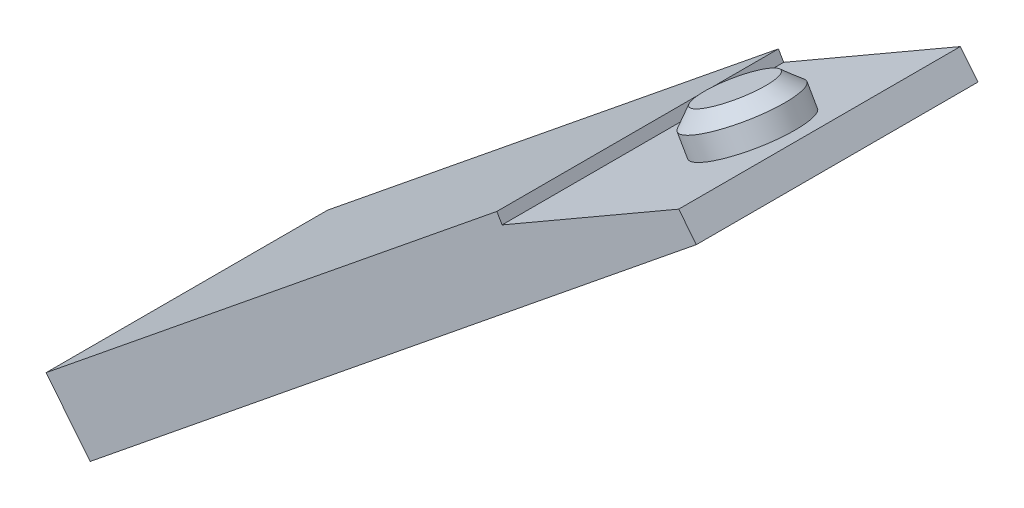
ISO-10303-21;
HEADER;
FILE_DESCRIPTION(('STEP AP214'),'2;1');
FILE_NAME('part.step','',(''),(''),'','','');
FILE_SCHEMA(('AUTOMOTIVE_DESIGN { 1 0 10303 214 1 1 1 1 }'));
ENDSEC;
DATA;
#1=APPLICATION_CONTEXT('core data for automotive mechanical design processes');
#2=APPLICATION_PROTOCOL_DEFINITION('international standard','automotive_design',2000,#1);
#3=PRODUCT_CONTEXT('',#1,'mechanical');
#4=PRODUCT('Part','Part','',(#3));
#5=PRODUCT_RELATED_PRODUCT_CATEGORY('part','',(#4));
#6=PRODUCT_DEFINITION_FORMATION('','',#4);
#7=PRODUCT_DEFINITION_CONTEXT('part definition',#1,'design');
#8=PRODUCT_DEFINITION('design','',#6,#7);
#9=PRODUCT_DEFINITION_SHAPE('','',#8);
#10=(LENGTH_UNIT() NAMED_UNIT(*) SI_UNIT(.MILLI.,.METRE.));
#11=(NAMED_UNIT(*) PLANE_ANGLE_UNIT() SI_UNIT($,.RADIAN.));
#12=(NAMED_UNIT(*) SI_UNIT($,.STERADIAN.) SOLID_ANGLE_UNIT());
#13=UNCERTAINTY_MEASURE_WITH_UNIT(LENGTH_MEASURE(1.E-05),#10,'distance_accuracy_value','');
#14=(GEOMETRIC_REPRESENTATION_CONTEXT(3) GLOBAL_UNCERTAINTY_ASSIGNED_CONTEXT((#13)) GLOBAL_UNIT_ASSIGNED_CONTEXT((#10,
#11,#12)) REPRESENTATION_CONTEXT('',''));
#15=CARTESIAN_POINT('',(0.,0.,0.));
#16=DIRECTION('',(0.,0.,1.));
#17=DIRECTION('',(1.,0.,0.));
#18=AXIS2_PLACEMENT_3D('',#15,#16,#17);
#19=CARTESIAN_POINT('',(-26.266761163299,4.46478752407708,10.));
#20=DIRECTION('',(0.5,-0.866025403784438,0.));
#21=DIRECTION('',(0.866025403784439,0.5,0.));
#22=AXIS2_PLACEMENT_3D('',#19,#20,#21);
#23=PLANE('',#22);
#24=CARTESIAN_POINT('',(-31.0166604983954,1.72243186433555,0.));
#25=DIRECTION('',(0.5,-0.866025403784438,0.));
#26=DIRECTION('',(0.866025403784439,0.5,0.));
#27=AXIS2_PLACEMENT_3D('',#24,#25,#26);
#28=CIRCLE('',#27,3.5);
#29=CARTESIAN_POINT('',(-27.9855715851499,3.47243186433555,0.));
#30=VERTEX_POINT('',#29);
#31=EDGE_CURVE('E141',#30,#30,#28,.F.);
#32=ORIENTED_EDGE('',*,*,#31,.F.);
#33=EDGE_LOOP('',(#32));
#34=FACE_BOUND('',#33,.T.);
#35=DIRECTION('',(0.,0.,-1.));
#36=VECTOR('',#35,1.);
#37=CARTESIAN_POINT('',(-38.8108891324554,-2.77756813566445,10.));
#38=LINE('',#37,#36);
#39=CARTESIAN_POINT('',(-38.8108891324554,-2.77756813566446,10.));
#40=VERTEX_POINT('',#39);
#41=CARTESIAN_POINT('',(-38.8108891324554,-2.77756813566446,-10.));
#42=VERTEX_POINT('',#41);
#43=EDGE_CURVE('E50',#40,#42,#38,.T.);
#44=ORIENTED_EDGE('',*,*,#43,.F.);
#45=DIRECTION('',(-0.866025403784438,-0.5,0.));
#46=VECTOR('',#45,1.);
#47=CARTESIAN_POINT('',(-26.266761163299,4.46478752407708,10.));
#48=LINE('',#47,#46);
#49=CARTESIAN_POINT('',(-26.266761163299,4.46478752407708,10.));
#50=VERTEX_POINT('',#49);
#51=EDGE_CURVE('E97',#50,#40,#48,.T.);
#52=ORIENTED_EDGE('',*,*,#51,.F.);
#53=DIRECTION('',(0.,0.,-1.));
#54=VECTOR('',#53,1.);
#55=CARTESIAN_POINT('',(-26.266761163299,4.46478752407708,10.));
#56=LINE('',#55,#54);
#57=CARTESIAN_POINT('',(-26.266761163299,4.46478752407707,-10.));
#58=VERTEX_POINT('',#57);
#59=EDGE_CURVE('E136',#50,#58,#56,.T.);
#60=ORIENTED_EDGE('',*,*,#59,.T.);
#61=DIRECTION('',(-0.866025403784438,-0.5,0.));
#62=VECTOR('',#61,1.);
#63=CARTESIAN_POINT('',(-26.266761163299,4.46478752407708,-10.));
#64=LINE('',#63,#62);
#65=EDGE_CURVE('E55',#58,#42,#64,.T.);
#66=ORIENTED_EDGE('',*,*,#65,.T.);
#67=EDGE_LOOP('',(#44,#52,#60,#66));
#68=FACE_BOUND('',#67,.T.);
#69=ADVANCED_FACE('F35',(#34,#68),#23,.F.);
#70=CARTESIAN_POINT('',(-71.2060241805051,-28.0660314331279,10.));
#71=DIRECTION('',(0.629320391049838,-0.777145961456971,0.));
#72=DIRECTION('',(0.777145961456971,0.629320391049838,0.));
#73=AXIS2_PLACEMENT_3D('',#70,#71,#72);
#74=PLANE('',#73);
#75=DIRECTION('',(-0.777145961456971,-0.629320391049838,0.));
#76=VECTOR('',#75,1.);
#77=CARTESIAN_POINT('',(-71.2060241805051,-28.0660314331279,-10.));
#78=LINE('',#77,#76);
#79=CARTESIAN_POINT('',(-39.182510373338,-2.13390126528401,-10.));
#80=VERTEX_POINT('',#79);
#81=CARTESIAN_POINT('',(-71.2060241805051,-28.0660314331279,-10.));
#82=VERTEX_POINT('',#81);
#83=EDGE_CURVE('E98',#80,#82,#78,.T.);
#84=ORIENTED_EDGE('',*,*,#83,.T.);
#85=DIRECTION('',(0.,0.,-1.));
#86=VECTOR('',#85,1.);
#87=CARTESIAN_POINT('',(-71.2060241805051,-28.0660314331279,10.));
#88=LINE('',#87,#86);
#89=CARTESIAN_POINT('',(-71.2060241805051,-28.0660314331279,10.));
#90=VERTEX_POINT('',#89);
#91=EDGE_CURVE('E95',#90,#82,#88,.T.);
#92=ORIENTED_EDGE('',*,*,#91,.F.);
#93=DIRECTION('',(-0.777145961456971,-0.629320391049838,0.));
#94=VECTOR('',#93,1.);
#95=CARTESIAN_POINT('',(-71.2060241805051,-28.0660314331279,10.));
#96=LINE('',#95,#94);
#97=CARTESIAN_POINT('',(-39.182510373338,-2.13390126528401,10.));
#98=VERTEX_POINT('',#97);
#99=EDGE_CURVE('E132',#98,#90,#96,.T.);
#100=ORIENTED_EDGE('',*,*,#99,.F.);
#101=DIRECTION('',(0.,0.,-1.));
#102=VECTOR('',#101,1.);
#103=CARTESIAN_POINT('',(-39.182510373338,-2.13390126528401,10.));
#104=LINE('',#103,#102);
#105=EDGE_CURVE('E125',#98,#80,#104,.T.);
#106=ORIENTED_EDGE('',*,*,#105,.T.);
#107=EDGE_LOOP('',(#84,#92,#100,#106));
#108=FACE_BOUND('',#107,.T.);
#109=ADVANCED_FACE('F162',(#108),#74,.F.);
#110=CARTESIAN_POINT('',(-69.3180630073556,-30.3974693174988,10.));
#111=DIRECTION('',(0.77714596145697,0.629320391049839,0.));
#112=DIRECTION('',(-0.629320391049839,0.77714596145697,0.));
#113=AXIS2_PLACEMENT_3D('',#110,#111,#112);
#114=PLANE('',#113);
#115=DIRECTION('',(0.629320391049839,-0.77714596145697,0.));
#116=VECTOR('',#115,1.);
#117=CARTESIAN_POINT('',(-69.3180630073556,-30.3974693174988,-10.));
#118=LINE('',#117,#116);
#119=CARTESIAN_POINT('',(-68.0594222252559,-31.9517612404127,-10.));
#120=VERTEX_POINT('',#119);
#121=EDGE_CURVE('E88',#82,#120,#118,.T.);
#122=ORIENTED_EDGE('',*,*,#121,.T.);
#123=DIRECTION('',(0.,0.,-1.));
#124=VECTOR('',#123,1.);
#125=CARTESIAN_POINT('',(-68.0594222252559,-31.9517612404127,10.));
#126=LINE('',#125,#124);
#127=CARTESIAN_POINT('',(-68.0594222252559,-31.9517612404127,10.));
#128=VERTEX_POINT('',#127);
#129=EDGE_CURVE('E93',#128,#120,#126,.T.);
#130=ORIENTED_EDGE('',*,*,#129,.F.);
#131=DIRECTION('',(0.629320391049839,-0.77714596145697,0.));
#132=VECTOR('',#131,1.);
#133=CARTESIAN_POINT('',(-69.3180630073556,-30.3974693174988,10.));
#134=LINE('',#133,#132);
#135=EDGE_CURVE('E134',#90,#128,#134,.T.);
#136=ORIENTED_EDGE('',*,*,#135,.F.);
#137=ORIENTED_EDGE('',*,*,#91,.T.);
#138=EDGE_LOOP('',(#122,#130,#136,#137));
#139=FACE_BOUND('',#138,.T.);
#140=ADVANCED_FACE('F90',(#139),#114,.F.);
#141=CARTESIAN_POINT('',(0.,0.,10.));
#142=DIRECTION('',(0.,0.,-1.));
#143=DIRECTION('',(-1.,0.,0.));
#144=AXIS2_PLACEMENT_3D('',#141,#142,#143);
#145=PLANE('',#144);
#146=ORIENTED_EDGE('',*,*,#51,.T.);
#147=DIRECTION('',(-0.500000000000006,0.866025403784435,0.));
#148=VECTOR('',#147,1.);
#149=CARTESIAN_POINT('',(-38.8108891324554,-2.77756813566445,10.));
#150=LINE('',#149,#148);
#151=EDGE_CURVE('E122',#40,#98,#150,.T.);
#152=ORIENTED_EDGE('',*,*,#151,.T.);
#153=ORIENTED_EDGE('',*,*,#99,.T.);
#154=ORIENTED_EDGE('',*,*,#135,.T.);
#155=DIRECTION('',(-0.777145961456971,-0.629320391049838,0.));
#156=VECTOR('',#155,1.);
#157=CARTESIAN_POINT('',(-25.0081203811993,2.91049560116313,10.));
#158=LINE('',#157,#156);
#159=CARTESIAN_POINT('',(-25.0081203811993,2.91049560116313,10.));
#160=VERTEX_POINT('',#159);
#161=EDGE_CURVE('E112',#160,#128,#158,.T.);
#162=ORIENTED_EDGE('',*,*,#161,.F.);
#163=DIRECTION('',(-0.629320391049838,0.777145961456971,0.));
#164=VECTOR('',#163,1.);
#165=CARTESIAN_POINT('',(-25.0081203811993,2.91049560116313,10.));
#166=LINE('',#165,#164);
#167=EDGE_CURVE('E117',#160,#50,#166,.T.);
#168=ORIENTED_EDGE('',*,*,#167,.T.);
#169=EDGE_LOOP('',(#146,#152,#153,#154,#162,#168));
#170=FACE_BOUND('',#169,.T.);
#171=ADVANCED_FACE('F173',(#170),#145,.F.);
#172=CARTESIAN_POINT('',(0.,0.,-10.));
#173=DIRECTION('',(0.,0.,-1.));
#174=DIRECTION('',(-1.,0.,0.));
#175=AXIS2_PLACEMENT_3D('',#172,#173,#174);
#176=PLANE('',#175);
#177=ORIENTED_EDGE('',*,*,#65,.F.);
#178=DIRECTION('',(-0.629320391049838,0.777145961456971,0.));
#179=VECTOR('',#178,1.);
#180=CARTESIAN_POINT('',(-25.0081203811993,2.91049560116313,-10.));
#181=LINE('',#180,#179);
#182=CARTESIAN_POINT('',(-25.0081203811993,2.91049560116313,-10.));
#183=VERTEX_POINT('',#182);
#184=EDGE_CURVE('E104',#183,#58,#181,.T.);
#185=ORIENTED_EDGE('',*,*,#184,.F.);
#186=DIRECTION('',(0.777145961456971,0.629320391049838,0.));
#187=VECTOR('',#186,1.);
#188=CARTESIAN_POINT('',(-68.0594222252559,-31.9517612404127,-10.));
#189=LINE('',#188,#187);
#190=EDGE_CURVE('E101',#120,#183,#189,.T.);
#191=ORIENTED_EDGE('',*,*,#190,.F.);
#192=ORIENTED_EDGE('',*,*,#121,.F.);
#193=ORIENTED_EDGE('',*,*,#83,.F.);
#194=DIRECTION('',(-0.500000000000006,0.866025403784435,0.));
#195=VECTOR('',#194,1.);
#196=CARTESIAN_POINT('',(-38.8108891324554,-2.77756813566445,-10.));
#197=LINE('',#196,#195);
#198=EDGE_CURVE('E121',#42,#80,#197,.T.);
#199=ORIENTED_EDGE('',*,*,#198,.F.);
#200=EDGE_LOOP('',(#177,#185,#191,#192,#193,#199));
#201=FACE_BOUND('',#200,.T.);
#202=ADVANCED_FACE('F102',(#201),#176,.T.);
#203=CARTESIAN_POINT('',(-32.2666604983954,3.88749537379665,0.));
#204=DIRECTION('',(0.5,-0.866025403784439,0.));
#205=DIRECTION('',(0.866025403784439,0.5,0.));
#206=AXIS2_PLACEMENT_3D('',#203,#204,#205);
#207=CYLINDRICAL_SURFACE('',#206,3.5);
#208=CARTESIAN_POINT('',(-31.7666604983954,3.02146997001219,0.));
#209=DIRECTION('',(-0.499999999999999,0.866025403784439,0.));
#210=DIRECTION('',(-0.866025403784439,-0.5,0.));
#211=AXIS2_PLACEMENT_3D('',#208,#209,#210);
#212=CIRCLE('',#211,3.5);
#213=CARTESIAN_POINT('',(-34.7977494116409,1.27146997001219,0.));
#214=VERTEX_POINT('',#213);
#215=EDGE_CURVE('E11',#214,#214,#212,.F.);
#216=ORIENTED_EDGE('',*,*,#215,.T.);
#217=EDGE_LOOP('',(#216));
#218=FACE_BOUND('',#217,.T.);
#219=ORIENTED_EDGE('',*,*,#31,.T.);
#220=EDGE_LOOP('',(#219));
#221=FACE_BOUND('',#220,.T.);
#222=ADVANCED_FACE('F158',(#218,#221),#207,.T.);
#223=CARTESIAN_POINT('',(-32.2666604983954,3.88749537379665,0.));
#224=DIRECTION('',(-0.5,0.866025403784439,0.));
#225=DIRECTION('',(-0.866025403784439,-0.5,0.));
#226=AXIS2_PLACEMENT_3D('',#223,#224,#225);
#227=PLANE('',#226);
#228=CARTESIAN_POINT('',(-32.2666604983954,3.88749537379665,0.));
#229=DIRECTION('',(-0.5,0.866025403784439,0.));
#230=DIRECTION('',(-0.866025403784439,-0.5,0.));
#231=AXIS2_PLACEMENT_3D('',#228,#229,#230);
#232=CIRCLE('',#231,2.49999999999999);
#233=CARTESIAN_POINT('',(-34.4317240078565,2.63749537379665,0.));
#234=VERTEX_POINT('',#233);
#235=EDGE_CURVE('E43',#234,#234,#232,.T.);
#236=ORIENTED_EDGE('',*,*,#235,.T.);
#237=EDGE_LOOP('',(#236));
#238=FACE_BOUND('',#237,.T.);
#239=ADVANCED_FACE('F146',(#238),#227,.T.);
#240=CARTESIAN_POINT('',(-32.2666604983954,3.88749537379665,0.));
#241=DIRECTION('',(0.499999999999999,-0.866025403784439,0.));
#242=DIRECTION('',(0.866025403784439,0.5,0.));
#243=AXIS2_PLACEMENT_3D('',#240,#241,#242);
#244=CONICAL_SURFACE('',#243,2.49999999999999,0.785398163397447);
#245=ORIENTED_EDGE('',*,*,#215,.F.);
#246=EDGE_LOOP('',(#245));
#247=FACE_BOUND('',#246,.T.);
#248=ORIENTED_EDGE('',*,*,#235,.F.);
#249=EDGE_LOOP('',(#248));
#250=FACE_BOUND('',#249,.T.);
#251=ADVANCED_FACE('F37',(#247,#250),#244,.T.);
#252=CARTESIAN_POINT('',(-38.8108891324554,-2.77756813566445,10.));
#253=DIRECTION('',(-0.866025403784435,-0.500000000000006,0.));
#254=DIRECTION('',(0.500000000000006,-0.866025403784435,0.));
#255=AXIS2_PLACEMENT_3D('',#252,#253,#254);
#256=PLANE('',#255);
#257=ORIENTED_EDGE('',*,*,#198,.T.);
#258=ORIENTED_EDGE('',*,*,#105,.F.);
#259=ORIENTED_EDGE('',*,*,#151,.F.);
#260=ORIENTED_EDGE('',*,*,#43,.T.);
#261=EDGE_LOOP('',(#257,#258,#259,#260));
#262=FACE_BOUND('',#261,.T.);
#263=ADVANCED_FACE('F149',(#262),#256,.F.);
#264=CARTESIAN_POINT('',(-25.0081203811993,2.91049560116313,-10.));
#265=DIRECTION('',(-0.777145961456971,-0.629320391049838,0.));
#266=DIRECTION('',(0.629320391049838,-0.777145961456971,0.));
#267=AXIS2_PLACEMENT_3D('',#264,#265,#266);
#268=PLANE('',#267);
#269=ORIENTED_EDGE('',*,*,#59,.F.);
#270=ORIENTED_EDGE('',*,*,#167,.F.);
#271=DIRECTION('',(0.,0.,1.));
#272=VECTOR('',#271,1.);
#273=CARTESIAN_POINT('',(-25.0081203811993,2.91049560116313,-10.));
#274=LINE('',#273,#272);
#275=EDGE_CURVE('E107',#183,#160,#274,.T.);
#276=ORIENTED_EDGE('',*,*,#275,.F.);
#277=ORIENTED_EDGE('',*,*,#184,.T.);
#278=EDGE_LOOP('',(#269,#270,#276,#277));
#279=FACE_BOUND('',#278,.T.);
#280=ADVANCED_FACE('F155',(#279),#268,.F.);
#281=CARTESIAN_POINT('',(-11.3277670388971,13.9886273062255,0.));
#282=DIRECTION('',(0.629320391049838,-0.777145961456971,0.));
#283=DIRECTION('',(0.777145961456971,0.629320391049838,0.));
#284=AXIS2_PLACEMENT_3D('',#281,#282,#283);
#285=PLANE('',#284);
#286=ORIENTED_EDGE('',*,*,#129,.T.);
#287=ORIENTED_EDGE('',*,*,#190,.T.);
#288=ORIENTED_EDGE('',*,*,#275,.T.);
#289=ORIENTED_EDGE('',*,*,#161,.T.);
#290=EDGE_LOOP('',(#286,#287,#288,#289));
#291=FACE_BOUND('',#290,.T.);
#292=ADVANCED_FACE('F110',(#291),#285,.T.);
#293=CLOSED_SHELL('',(#69,#109,#140,#171,#202,#222,#239,#251,#263,#280,#292));
#294=MANIFOLD_SOLID_BREP('B2',#293);
#295=ADVANCED_BREP_SHAPE_REPRESENTATION('',(#18,#294),#14);
#296=SHAPE_DEFINITION_REPRESENTATION(#9,#295);
ENDSEC;
END-ISO-10303-21;
